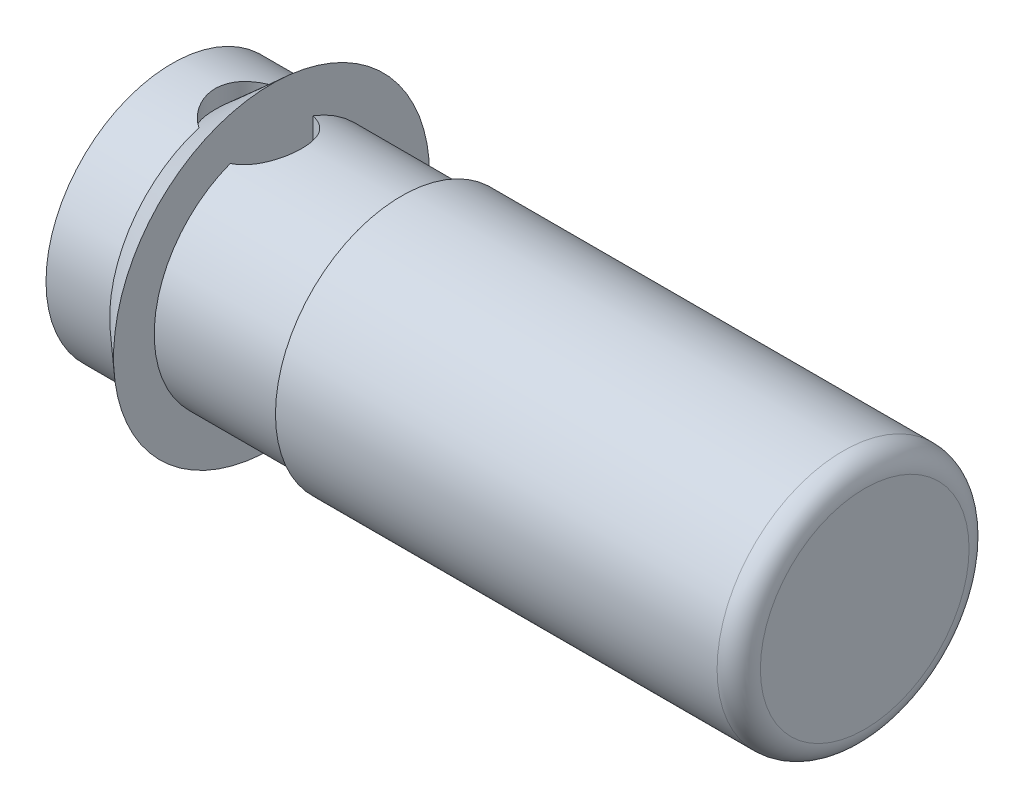
ISO-10303-21;
HEADER;
FILE_DESCRIPTION(('STEP AP214'),'2;1');
FILE_NAME('part.step','',(''),(''),'','','');
FILE_SCHEMA(('AUTOMOTIVE_DESIGN { 1 0 10303 214 1 1 1 1 }'));
ENDSEC;
DATA;
#1=APPLICATION_CONTEXT('core data for automotive mechanical design processes');
#2=APPLICATION_PROTOCOL_DEFINITION('international standard','automotive_design',2000,#1);
#3=PRODUCT_CONTEXT('',#1,'mechanical');
#4=PRODUCT('Part','Part','',(#3));
#5=PRODUCT_RELATED_PRODUCT_CATEGORY('part','',(#4));
#6=PRODUCT_DEFINITION_FORMATION('','',#4);
#7=PRODUCT_DEFINITION_CONTEXT('part definition',#1,'design');
#8=PRODUCT_DEFINITION('design','',#6,#7);
#9=PRODUCT_DEFINITION_SHAPE('','',#8);
#10=(LENGTH_UNIT() NAMED_UNIT(*) SI_UNIT(.MILLI.,.METRE.));
#11=(NAMED_UNIT(*) PLANE_ANGLE_UNIT() SI_UNIT($,.RADIAN.));
#12=(NAMED_UNIT(*) SI_UNIT($,.STERADIAN.) SOLID_ANGLE_UNIT());
#13=UNCERTAINTY_MEASURE_WITH_UNIT(LENGTH_MEASURE(1.E-05),#10,'distance_accuracy_value','');
#14=(GEOMETRIC_REPRESENTATION_CONTEXT(3) GLOBAL_UNCERTAINTY_ASSIGNED_CONTEXT((#13)) GLOBAL_UNIT_ASSIGNED_CONTEXT((#10,
#11,#12)) REPRESENTATION_CONTEXT('',''));
#15=CARTESIAN_POINT('',(0.,0.,0.));
#16=DIRECTION('',(0.,0.,1.));
#17=DIRECTION('',(1.,0.,0.));
#18=AXIS2_PLACEMENT_3D('',#15,#16,#17);
#19=CARTESIAN_POINT('',(1.,-2.5,0.));
#20=DIRECTION('',(0.,1.,0.));
#21=DIRECTION('',(0.,0.,1.));
#22=AXIS2_PLACEMENT_3D('',#19,#20,#21);
#23=CYLINDRICAL_SURFACE('',#22,0.500000000000001);
#24=DIRECTION('',(0.,1.,0.));
#25=VECTOR('',#24,1.);
#26=CARTESIAN_POINT('',(1.15,-2.5,-0.476969600708474));
#27=LINE('',#26,#25);
#28=CARTESIAN_POINT('',(1.15,1.26827638943568,-0.476969600708474));
#29=VERTEX_POINT('',#28);
#30=CARTESIAN_POINT('',(1.15,-1.26827638943568,-0.476969600708474));
#31=VERTEX_POINT('',#30);
#32=EDGE_CURVE('E109',#29,#31,#27,.F.);
#33=ORIENTED_EDGE('',*,*,#32,.T.);
#34=CARTESIAN_POINT('',(1.15,-1.26827638943568,-0.476969600708474));
#35=CARTESIAN_POINT('',(1.17707320786269,-1.27146217352284,-0.468471494215187));
#36=CARTESIAN_POINT('',(1.20329073628372,-1.27543470489075,-0.457680132332515));
#37=CARTESIAN_POINT('',(1.25337578262997,-1.28437862323989,-0.431957831491658));
#38=CARTESIAN_POINT('',(1.27724699269246,-1.2893484022229,-0.417033542077902));
#39=CARTESIAN_POINT('',(1.32207027598212,-1.29972115961105,-0.38347805003048));
#40=CARTESIAN_POINT('',(1.3430250507571,-1.3051237297039,-0.364850317343819));
#41=CARTESIAN_POINT('',(1.38156283330663,-1.3157783292706,-0.324332095393039));
#42=CARTESIAN_POINT('',(1.39914467710097,-1.3210303062457,-0.302440484397228));
#43=CARTESIAN_POINT('',(1.43080061311372,-1.33093293762257,-0.255404632348794));
#44=CARTESIAN_POINT('',(1.4447905460512,-1.3355681164359,-0.230200246198972));
#45=CARTESIAN_POINT('',(1.46828325346842,-1.34357423958663,-0.177594110362837));
#46=CARTESIAN_POINT('',(1.47778765886733,-1.34694564333552,-0.150193163582698));
#47=CARTESIAN_POINT('',(1.49163582105204,-1.35192112137594,-0.0952036968093729));
#48=CARTESIAN_POINT('',(1.49618106725334,-1.35359398936399,-0.0676722545700567));
#49=CARTESIAN_POINT('',(1.50062483097179,-1.35522900207713,-0.0121901372272815));
#50=CARTESIAN_POINT('',(1.50052483083461,-1.35519169253744,0.0157604012920708));
#51=CARTESIAN_POINT('',(1.4958025730897,-1.35345524542596,0.0698748884869474));
#52=CARTESIAN_POINT('',(1.49139560057745,-1.35183522156096,0.0960605883379962));
#53=CARTESIAN_POINT('',(1.47854269552372,-1.34721651902574,0.147290396409011));
#54=CARTESIAN_POINT('',(1.47009656906637,-1.34421777416473,0.172334449756397));
#55=CARTESIAN_POINT('',(1.44929414487845,-1.33708401285122,0.221011297041621));
#56=CARTESIAN_POINT('',(1.43688151655715,-1.33293274768171,0.244617536106446));
#57=CARTESIAN_POINT('',(1.40854366873735,-1.32391571325597,0.28947632883391));
#58=CARTESIAN_POINT('',(1.39261655408508,-1.31904955897749,0.310727603280625));
#59=CARTESIAN_POINT('',(1.35663778295056,-1.30877866046371,0.351556527651231));
#60=CARTESIAN_POINT('',(1.33640184255477,-1.30335903407353,0.370968073554817));
#61=CARTESIAN_POINT('',(1.29293739078891,-1.2928242936123,0.406162630831862));
#62=CARTESIAN_POINT('',(1.26971182943294,-1.28770888653161,0.421949176992239));
#63=CARTESIAN_POINT('',(1.23021517705009,-1.28015838579274,0.444184840885369));
#64=CARTESIAN_POINT('',(1.2146930912011,-1.27744775029141,0.451893046230115));
#65=CARTESIAN_POINT('',(1.18288582454099,-1.27248734724187,0.465674937975633));
#66=CARTESIAN_POINT('',(1.16660129239708,-1.27023719637683,0.47174998518289));
#67=CARTESIAN_POINT('',(1.15,-1.26827638943568,0.476969600708474));
#68=B_SPLINE_CURVE_WITH_KNOTS('',3,(#34,#35,#36,#37,#38,#39,#40,#41,#42,#43,#44,#45,#46,#47,#48,
#49,#50,#51,#52,#53,#54,#55,#56,#57,#58,#59,#60,#61,#62,#63,#64,#65,#66,#67),.UNSPECIFIED.,.F.,
.F.,(4,2,2,2,2,2,2,2,2,2,2,2,2,2,2,2,4),(0.,0.0854921715261541,0.170847584349931,
0.256123397013881,0.341428585169494,0.428580140143339,0.515699982714112,0.599130653744928,
0.682534701377104,0.76197241443351,0.841413941600532,0.922037935106363,1.0027055110529,
1.0880038005055,1.17321855783553,1.22575181590795,1.2782411647328),.UNSPECIFIED.);
#69=CARTESIAN_POINT('',(1.15,-1.26827638943568,0.476969600708474));
#70=VERTEX_POINT('',#69);
#71=EDGE_CURVE('E101',#31,#70,#68,.T.);
#72=ORIENTED_EDGE('',*,*,#71,.T.);
#73=DIRECTION('',(0.,1.,0.));
#74=VECTOR('',#73,1.);
#75=CARTESIAN_POINT('',(1.15,-2.5,0.476969600708474));
#76=LINE('',#75,#74);
#77=CARTESIAN_POINT('',(1.15,1.26827638943568,0.476969600708474));
#78=VERTEX_POINT('',#77);
#79=EDGE_CURVE('E111',#70,#78,#76,.T.);
#80=ORIENTED_EDGE('',*,*,#79,.T.);
#81=CARTESIAN_POINT('',(1.15,1.26827638943568,0.476969600708474));
#82=CARTESIAN_POINT('',(1.17707320786269,1.27146217352284,0.468471494215187));
#83=CARTESIAN_POINT('',(1.20329073628372,1.27543470489075,0.457680132332515));
#84=CARTESIAN_POINT('',(1.25337578262997,1.28437862323989,0.431957831491659));
#85=CARTESIAN_POINT('',(1.27724699269246,1.2893484022229,0.417033542077902));
#86=CARTESIAN_POINT('',(1.32207027598212,1.29972115961105,0.38347805003048));
#87=CARTESIAN_POINT('',(1.3430250507571,1.3051237297039,0.364850317343819));
#88=CARTESIAN_POINT('',(1.38156283330663,1.3157783292706,0.324332095393039));
#89=CARTESIAN_POINT('',(1.39914467710097,1.3210303062457,0.302440484397228));
#90=CARTESIAN_POINT('',(1.43080061311372,1.33093293762257,0.255404632348794));
#91=CARTESIAN_POINT('',(1.4447905460512,1.3355681164359,0.230200246198973));
#92=CARTESIAN_POINT('',(1.46828325346842,1.34357423958663,0.177594110362838));
#93=CARTESIAN_POINT('',(1.47778765886733,1.34694564333552,0.150193163582699));
#94=CARTESIAN_POINT('',(1.49163582105204,1.35192112137594,0.0952036968093734));
#95=CARTESIAN_POINT('',(1.49618106725334,1.35359398936399,0.0676722545700571));
#96=CARTESIAN_POINT('',(1.50062483097179,1.35522900207713,0.0121901372272819));
#97=CARTESIAN_POINT('',(1.50052483083461,1.35519169253744,-0.0157604012920704));
#98=CARTESIAN_POINT('',(1.4958025730897,1.35345524542596,-0.069874888486947));
#99=CARTESIAN_POINT('',(1.49139560057745,1.35183522156096,-0.0960605883379957));
#100=CARTESIAN_POINT('',(1.47854269552372,1.34721651902574,-0.14729039640901));
#101=CARTESIAN_POINT('',(1.47009656906637,1.34421777416473,-0.172334449756397));
#102=CARTESIAN_POINT('',(1.44929414487846,1.33708401285122,-0.221011297041621));
#103=CARTESIAN_POINT('',(1.43688151655715,1.33293274768171,-0.244617536106446));
#104=CARTESIAN_POINT('',(1.40854366873735,1.32391571325597,-0.28947632883391));
#105=CARTESIAN_POINT('',(1.39261655408508,1.31904955897749,-0.310727603280625));
#106=CARTESIAN_POINT('',(1.35663778295056,1.30877866046371,-0.35155652765123));
#107=CARTESIAN_POINT('',(1.33640184255477,1.30335903407353,-0.370968073554816));
#108=CARTESIAN_POINT('',(1.29293739078891,1.2928242936123,-0.406162630831862));
#109=CARTESIAN_POINT('',(1.26971182943294,1.28770888653161,-0.421949176992239));
#110=CARTESIAN_POINT('',(1.23021517705009,1.28015838579274,-0.444184840885369));
#111=CARTESIAN_POINT('',(1.2146930912011,1.27744775029141,-0.451893046230115));
#112=CARTESIAN_POINT('',(1.182885824541,1.27248734724187,-0.465674937975633));
#113=CARTESIAN_POINT('',(1.16660129239708,1.27023719637683,-0.47174998518289));
#114=CARTESIAN_POINT('',(1.15,1.26827638943568,-0.476969600708474));
#115=B_SPLINE_CURVE_WITH_KNOTS('',3,(#81,#82,#83,#84,#85,#86,#87,#88,#89,#90,#91,#92,#93,#94,
#95,#96,#97,#98,#99,#100,#101,#102,#103,#104,#105,#106,#107,#108,#109,#110,#111,#112,#113,#114),
.UNSPECIFIED.,.F.,.F.,(4,2,2,2,2,2,2,2,2,2,2,2,2,2,2,2,4),(0.,0.0854921715261543,
0.170847584349931,0.25612339701388,0.341428585169494,0.428580140143339,0.515699982714112,
0.599130653744928,0.682534701377104,0.76197241443351,0.841413941600532,0.922037935106362,
1.0027055110529,1.0880038005055,1.17321855783552,1.22575181590795,1.2782411647328),.UNSPECIFIED.);
#116=EDGE_CURVE('E98',#78,#29,#115,.T.);
#117=ORIENTED_EDGE('',*,*,#116,.T.);
#118=EDGE_LOOP('',(#33,#72,#80,#117));
#119=FACE_BOUND('',#118,.T.);
#120=ADVANCED_FACE('F42',(#119),#23,.F.);
#121=CARTESIAN_POINT('',(1.15,0.,0.));
#122=DIRECTION('',(1.,0.,0.));
#123=DIRECTION('',(0.,0.,-1.));
#124=AXIS2_PLACEMENT_3D('',#121,#122,#123);
#125=PLANE('',#124);
#126=ORIENTED_EDGE('',*,*,#32,.F.);
#127=CARTESIAN_POINT('',(1.15,0.,0.));
#128=DIRECTION('',(1.,0.,0.));
#129=DIRECTION('',(0.,0.,-1.));
#130=AXIS2_PLACEMENT_3D('',#127,#128,#129);
#131=CIRCLE('',#130,1.355);
#132=EDGE_CURVE('E95',#31,#29,#131,.T.);
#133=ORIENTED_EDGE('',*,*,#132,.F.);
#134=EDGE_LOOP('',(#126,#133));
#135=FACE_BOUND('',#134,.T.);
#136=ORIENTED_EDGE('',*,*,#79,.F.);
#137=EDGE_CURVE('E105',#78,#70,#131,.T.);
#138=ORIENTED_EDGE('',*,*,#137,.F.);
#139=EDGE_LOOP('',(#136,#138));
#140=FACE_BOUND('',#139,.T.);
#141=CARTESIAN_POINT('',(1.15,0.,0.));
#142=DIRECTION('',(1.,0.,0.));
#143=DIRECTION('',(0.,0.,-1.));
#144=AXIS2_PLACEMENT_3D('',#141,#142,#143);
#145=CIRCLE('',#144,1.825);
#146=CARTESIAN_POINT('',(1.15,0.,-1.825));
#147=VERTEX_POINT('',#146);
#148=EDGE_CURVE('E221',#147,#147,#145,.T.);
#149=ORIENTED_EDGE('',*,*,#148,.T.);
#150=EDGE_LOOP('',(#149));
#151=FACE_BOUND('',#150,.T.);
#152=ADVANCED_FACE('F114',(#135,#140,#151),#125,.T.);
#153=CARTESIAN_POINT('',(1.15,0.,0.));
#154=DIRECTION('',(1.,0.,0.));
#155=DIRECTION('',(0.,0.,-1.));
#156=AXIS2_PLACEMENT_3D('',#153,#154,#155);
#157=CONICAL_SURFACE('',#156,1.825,0.727990048760649);
#158=ORIENTED_EDGE('',*,*,#148,.F.);
#159=EDGE_LOOP('',(#158));
#160=FACE_BOUND('',#159,.T.);
#161=CARTESIAN_POINT('',(0.734878048780488,0.,0.));
#162=DIRECTION('',(1.,0.,0.));
#163=DIRECTION('',(0.,0.,-1.));
#164=AXIS2_PLACEMENT_3D('',#161,#162,#163);
#165=CIRCLE('',#164,1.455);
#166=CARTESIAN_POINT('',(0.734878048780488,-1.39187450907704,0.423922576635828));
#167=VERTEX_POINT('',#166);
#168=CARTESIAN_POINT('',(0.734878048780484,1.39187450907703,0.423922576635826));
#169=VERTEX_POINT('',#168);
#170=EDGE_CURVE('E119',#167,#169,#165,.F.);
#171=ORIENTED_EDGE('',*,*,#170,.F.);
#172=CARTESIAN_POINT('',(1.08402815427549,-1.69603056083662,-0.492888698682628));
#173=CARTESIAN_POINT('',(1.06912706986425,-1.68146215451666,-0.495425363460217));
#174=CARTESIAN_POINT('',(1.05409144566064,-1.66692555201327,-0.497297025572262));
#175=CARTESIAN_POINT('',(1.02376775711919,-1.63797991900439,-0.499667339972131));
#176=CARTESIAN_POINT('',(1.00847949419149,-1.62357100401303,-0.500164854864762));
#177=CARTESIAN_POINT('',(0.962035783845365,-1.5804243747266,-0.499523236731664));
#178=CARTESIAN_POINT('',(0.930556546092024,-1.55201789718606,-0.496204944834697));
#179=CARTESIAN_POINT('',(0.871562776100839,-1.50070098632695,-0.484030668670223));
#180=CARTESIAN_POINT('',(0.844081188211441,-1.47756366465976,-0.475974841156331));
#181=CARTESIAN_POINT('',(0.78957877667533,-1.43342933347381,-0.45450621835594));
#182=CARTESIAN_POINT('',(0.762556686793122,-1.41242518822005,-0.441112074425632));
#183=CARTESIAN_POINT('',(0.7151408425938,-1.37721862584324,-0.411670247708972));
#184=CARTESIAN_POINT('',(0.694491389198619,-1.36249192663769,-0.396667849743683));
#185=CARTESIAN_POINT('',(0.654903394365703,-1.33538401722898,-0.362748277716728));
#186=CARTESIAN_POINT('',(0.635964401429897,-1.32300218711527,-0.343832141100912));
#187=CARTESIAN_POINT('',(0.600658748367836,-1.30086329021434,-0.302121267724923));
#188=CARTESIAN_POINT('',(0.584310034932162,-1.29112422876772,-0.279301570750145));
#189=CARTESIAN_POINT('',(0.555367209079923,-1.27452600981576,-0.230448129938268));
#190=CARTESIAN_POINT('',(0.542771925333758,-1.2676659535883,-0.204415392385927));
#191=CARTESIAN_POINT('',(0.523344387720013,-1.25737485367337,-0.153176541623855));
#192=CARTESIAN_POINT('',(0.516017447939092,-1.2536411597553,-0.128216979873949));
#193=CARTESIAN_POINT('',(0.505318059995114,-1.24825703980475,-0.0772478886607582));
#194=CARTESIAN_POINT('',(0.501944853879415,-1.24660621447018,-0.0512385614326273));
#195=CARTESIAN_POINT('',(0.499361044429208,-1.24533843348936,0.000142046459201334));
#196=CARTESIAN_POINT('',(0.500012624439808,-1.24565414298062,0.0255048999415215));
#197=CARTESIAN_POINT('',(0.505126369259904,-1.24817607041727,0.0757451777246219));
#198=CARTESIAN_POINT('',(0.509587948095439,-1.25038199764927,0.100622676070755));
#199=CARTESIAN_POINT('',(0.522108615855352,-1.25676222024965,0.149154138271379));
#200=CARTESIAN_POINT('',(0.5301628169078,-1.26093384166457,0.172809715958147));
#201=CARTESIAN_POINT('',(0.549483612672926,-1.2713376616549,0.218277621393319));
#202=CARTESIAN_POINT('',(0.560749860955156,-1.27756963802545,0.240090147592511));
#203=CARTESIAN_POINT('',(0.586076409252665,-1.29219444341482,0.281536773743717));
#204=CARTESIAN_POINT('',(0.600162725044808,-1.3006076253612,0.301147717369096));
#205=CARTESIAN_POINT('',(0.630405986390042,-1.31947164627459,0.337581875634257));
#206=CARTESIAN_POINT('',(0.646563315234667,-1.32992286261676,0.354404572916077));
#207=CARTESIAN_POINT('',(0.681493607716794,-1.35345329167875,0.386200001666804));
#208=CARTESIAN_POINT('',(0.700370696473908,-1.36666593193989,0.400958335216493));
#209=CARTESIAN_POINT('',(0.7390869985445,-1.39483135734691,0.427167456010803));
#210=CARTESIAN_POINT('',(0.758926897805767,-1.40978539407791,0.438615843475009));
#211=CARTESIAN_POINT('',(0.809514872833869,-1.44921340976233,0.463544732738046));
#212=CARTESIAN_POINT('',(0.840566789077614,-1.47459189020377,0.474982532048995));
#213=CARTESIAN_POINT('',(0.902660150509213,-1.52741487361032,0.49148920227854));
#214=CARTESIAN_POINT('',(0.933701333304995,-1.55486485308673,0.496540515964789));
#215=CARTESIAN_POINT('',(0.984767633833629,-1.6014376892923,0.500184369281854));
#216=CARTESIAN_POINT('',(1.00498200648409,-1.62025153542169,0.500379177345684));
#217=CARTESIAN_POINT('',(1.04488484465355,-1.6580398320934,0.498376723935523));
#218=CARTESIAN_POINT('',(1.06457593556211,-1.67701234702015,0.496195567355824));
#219=CARTESIAN_POINT('',(1.08402815427549,-1.69603056083662,0.492888698682628));
#220=B_SPLINE_CURVE_WITH_KNOTS('',3,(#172,#173,#174,#175,#176,#177,#178,#179,#180,#181,#182,
#183,#184,#185,#186,#187,#188,#189,#190,#191,#192,#193,#194,#195,#196,#197,#198,#199,#200,#201,
#202,#203,#204,#205,#206,#207,#208,#209,#210,#211,#212,#213,#214,#215,#216,#217,#218,#219),
.UNSPECIFIED.,.F.,.F.,(4,2,2,2,2,2,2,2,2,2,2,2,2,2,2,2,2,2,2,2,2,2,2,4),(0.,0.0629531632558808,
0.125958417872378,0.25304272249733,0.363126944663535,0.472829872595913,0.560883661306851,
0.648914138735262,0.737530116953665,0.826118411829836,0.904564999012976,0.982996545089906,
1.05875767782518,1.13450716067307,1.21015389690693,1.28579247746203,1.36216397449434,
1.43854962640075,1.52032701974616,1.60216355558457,1.72658622205156,1.851350203169,
1.93409591003135,2.01628421573448),.UNSPECIFIED.);
#221=CARTESIAN_POINT('',(0.734878048780514,-1.39187450907704,-0.423922576635845));
#222=VERTEX_POINT('',#221);
#223=EDGE_CURVE('E211',#222,#167,#220,.T.);
#224=ORIENTED_EDGE('',*,*,#223,.F.);
#225=CARTESIAN_POINT('',(0.734878048780488,1.39187450907704,-0.423922576635828));
#226=VERTEX_POINT('',#225);
#227=EDGE_CURVE('E116',#226,#222,#165,.F.);
#228=ORIENTED_EDGE('',*,*,#227,.F.);
#229=CARTESIAN_POINT('',(1.08402815427549,1.69603056083662,0.492888698682628));
#230=CARTESIAN_POINT('',(1.06912706986425,1.68146215451666,0.495425363460217));
#231=CARTESIAN_POINT('',(1.05409144566064,1.66692555201327,0.497297025572262));
#232=CARTESIAN_POINT('',(1.02376775711919,1.63797991900439,0.499667339972131));
#233=CARTESIAN_POINT('',(1.00847949419149,1.62357100401303,0.500164854864762));
#234=CARTESIAN_POINT('',(0.962035783845365,1.5804243747266,0.499523236731664));
#235=CARTESIAN_POINT('',(0.930556546092024,1.55201789718606,0.496204944834697));
#236=CARTESIAN_POINT('',(0.871562776100839,1.50070098632695,0.484030668670223));
#237=CARTESIAN_POINT('',(0.844081188211441,1.47756366465976,0.475974841156331));
#238=CARTESIAN_POINT('',(0.78957877667533,1.43342933347381,0.45450621835594));
#239=CARTESIAN_POINT('',(0.762556686793122,1.41242518822005,0.441112074425632));
#240=CARTESIAN_POINT('',(0.7151408425938,1.37721862584324,0.411670247708972));
#241=CARTESIAN_POINT('',(0.694491389198619,1.36249192663769,0.396667849743683));
#242=CARTESIAN_POINT('',(0.654903394365703,1.33538401722898,0.362748277716728));
#243=CARTESIAN_POINT('',(0.635964401429897,1.32300218711527,0.343832141100912));
#244=CARTESIAN_POINT('',(0.600658748367836,1.30086329021434,0.302121267724923));
#245=CARTESIAN_POINT('',(0.584310034932162,1.29112422876772,0.279301570750145));
#246=CARTESIAN_POINT('',(0.555367209079923,1.27452600981576,0.230448129938268));
#247=CARTESIAN_POINT('',(0.542771925333758,1.2676659535883,0.204415392385927));
#248=CARTESIAN_POINT('',(0.523344387720013,1.25737485367337,0.153176541623855));
#249=CARTESIAN_POINT('',(0.516017447939092,1.2536411597553,0.128216979873949));
#250=CARTESIAN_POINT('',(0.505318059995114,1.24825703980475,0.0772478886607582));
#251=CARTESIAN_POINT('',(0.501944853879415,1.24660621447018,0.0512385614326273));
#252=CARTESIAN_POINT('',(0.499361044429208,1.24533843348936,-0.000142046459201334));
#253=CARTESIAN_POINT('',(0.500012624439808,1.24565414298062,-0.0255048999415215));
#254=CARTESIAN_POINT('',(0.505126369259904,1.24817607041727,-0.0757451777246219));
#255=CARTESIAN_POINT('',(0.509587948095439,1.25038199764927,-0.100622676070755));
#256=CARTESIAN_POINT('',(0.522108615855352,1.25676222024965,-0.149154138271379));
#257=CARTESIAN_POINT('',(0.5301628169078,1.26093384166457,-0.172809715958147));
#258=CARTESIAN_POINT('',(0.549483612672926,1.2713376616549,-0.218277621393319));
#259=CARTESIAN_POINT('',(0.560749860955156,1.27756963802545,-0.240090147592511));
#260=CARTESIAN_POINT('',(0.586076409252665,1.29219444341482,-0.281536773743717));
#261=CARTESIAN_POINT('',(0.600162725044808,1.3006076253612,-0.301147717369096));
#262=CARTESIAN_POINT('',(0.630405986390042,1.31947164627459,-0.337581875634257));
#263=CARTESIAN_POINT('',(0.646563315234667,1.32992286261676,-0.354404572916077));
#264=CARTESIAN_POINT('',(0.681493607716794,1.35345329167875,-0.386200001666804));
#265=CARTESIAN_POINT('',(0.700370696473908,1.36666593193989,-0.400958335216493));
#266=CARTESIAN_POINT('',(0.7390869985445,1.39483135734691,-0.427167456010803));
#267=CARTESIAN_POINT('',(0.758926897805767,1.40978539407791,-0.438615843475009));
#268=CARTESIAN_POINT('',(0.809514872833869,1.44921340976233,-0.463544732738046));
#269=CARTESIAN_POINT('',(0.840566789077614,1.47459189020377,-0.474982532048995));
#270=CARTESIAN_POINT('',(0.902660150509213,1.52741487361032,-0.49148920227854));
#271=CARTESIAN_POINT('',(0.933701333304995,1.55486485308673,-0.496540515964789));
#272=CARTESIAN_POINT('',(0.984767633833629,1.6014376892923,-0.500184369281854));
#273=CARTESIAN_POINT('',(1.00498200648409,1.62025153542169,-0.500379177345684));
#274=CARTESIAN_POINT('',(1.04488484465355,1.6580398320934,-0.498376723935523));
#275=CARTESIAN_POINT('',(1.06457593556211,1.67701234702015,-0.496195567355824));
#276=CARTESIAN_POINT('',(1.08402815427549,1.69603056083662,-0.492888698682628));
#277=B_SPLINE_CURVE_WITH_KNOTS('',3,(#229,#230,#231,#232,#233,#234,#235,#236,#237,#238,#239,
#240,#241,#242,#243,#244,#245,#246,#247,#248,#249,#250,#251,#252,#253,#254,#255,#256,#257,#258,
#259,#260,#261,#262,#263,#264,#265,#266,#267,#268,#269,#270,#271,#272,#273,#274,#275,#276),
.UNSPECIFIED.,.F.,.F.,(4,2,2,2,2,2,2,2,2,2,2,2,2,2,2,2,2,2,2,2,2,2,2,4),(0.,0.0629531632558808,
0.125958417872378,0.25304272249733,0.363126944663535,0.472829872595913,0.560883661306851,
0.648914138735262,0.737530116953665,0.826118411829836,0.904564999012976,0.982996545089906,
1.05875767782518,1.13450716067307,1.21015389690693,1.28579247746203,1.36216397449434,
1.43854962640075,1.52032701974616,1.60216355558457,1.72658622205156,1.851350203169,
1.93409591003135,2.01628421573448),.UNSPECIFIED.);
#278=EDGE_CURVE('E218',#169,#226,#277,.T.);
#279=ORIENTED_EDGE('',*,*,#278,.F.);
#280=EDGE_LOOP('',(#171,#224,#228,#279));
#281=FACE_BOUND('',#280,.T.);
#282=ADVANCED_FACE('F148',(#160,#281),#157,.T.);
#283=CARTESIAN_POINT('',(0.,0.,0.));
#284=DIRECTION('',(1.,0.,0.));
#285=DIRECTION('',(0.,0.,-1.));
#286=AXIS2_PLACEMENT_3D('',#283,#284,#285);
#287=PLANE('',#286);
#288=CARTESIAN_POINT('',(0.,0.,0.));
#289=DIRECTION('',(1.,0.,0.));
#290=DIRECTION('',(0.,0.,-1.));
#291=AXIS2_PLACEMENT_3D('',#288,#289,#290);
#292=CIRCLE('',#291,1.455);
#293=CARTESIAN_POINT('',(0.,0.,-1.455));
#294=VERTEX_POINT('',#293);
#295=EDGE_CURVE('E168',#294,#294,#292,.T.);
#296=ORIENTED_EDGE('',*,*,#295,.F.);
#297=EDGE_LOOP('',(#296));
#298=FACE_BOUND('',#297,.T.);
#299=ADVANCED_FACE('F187',(#298),#287,.F.);
#300=CARTESIAN_POINT('',(6.,0.,0.));
#301=DIRECTION('',(-1.,0.,0.));
#302=DIRECTION('',(0.,0.,1.));
#303=AXIS2_PLACEMENT_3D('',#300,#301,#302);
#304=CYLINDRICAL_SURFACE('',#303,1.455);
#305=ORIENTED_EDGE('',*,*,#295,.T.);
#306=EDGE_LOOP('',(#305));
#307=FACE_BOUND('',#306,.T.);
#308=CARTESIAN_POINT('',(1.,-1.36639123240747,0.500000000000001));
#309=CARTESIAN_POINT('',(1.02717955991746,-1.36639097811817,0.500000312731613));
#310=CARTESIAN_POINT('',(1.05435695805042,-1.3672110489003,0.497776345713997));
#311=CARTESIAN_POINT('',(1.10790316012987,-1.37038431023373,0.488971673841802));
#312=CARTESIAN_POINT('',(1.13427187170271,-1.37273767525038,0.482390473199555));
#313=CARTESIAN_POINT('',(1.18541562417104,-1.37868015875037,0.465132564264617));
#314=CARTESIAN_POINT('',(1.21019382677888,-1.38226672943625,0.454464294689386));
#315=CARTESIAN_POINT('',(1.25761726235279,-1.39026770944465,0.42936418702639));
#316=CARTESIAN_POINT('',(1.28026197809996,-1.39468231873585,0.414931439499747));
#317=CARTESIAN_POINT('',(1.32371799419318,-1.40404795409862,0.382068692414854));
#318=CARTESIAN_POINT('',(1.34442764982769,-1.40901294814996,0.363508230347457));
#319=CARTESIAN_POINT('',(1.38251026359022,-1.41880223847988,0.323194958876108));
#320=CARTESIAN_POINT('',(1.39988264712127,-1.42362651040849,0.301441600868594));
#321=CARTESIAN_POINT('',(1.43126543844549,-1.43275353066899,0.25461005240966));
#322=CARTESIAN_POINT('',(1.44516840090946,-1.43703795070782,0.229455972061946));
#323=CARTESIAN_POINT('',(1.46850489200208,-1.44443717268994,0.176993427231699));
#324=CARTESIAN_POINT('',(1.47793970594978,-1.44755231093828,0.149685584945859));
#325=CARTESIAN_POINT('',(1.49172461408698,-1.45216299283854,0.0947571154949558));
#326=CARTESIAN_POINT('',(1.49624903833515,-1.45371391556177,0.0671849745644271));
#327=CARTESIAN_POINT('',(1.5006400547362,-1.45521851130384,0.0116321325668069));
#328=CARTESIAN_POINT('',(1.50050792121369,-1.45517262131027,-0.0163484546287446));
#329=CARTESIAN_POINT('',(1.49569800888364,-1.45352574816606,-0.0706863211139648));
#330=CARTESIAN_POINT('',(1.49120979033516,-1.45198961593433,-0.0970626718601396));
#331=CARTESIAN_POINT('',(1.47812986112621,-1.44761714360993,-0.148662052440881));
#332=CARTESIAN_POINT('',(1.46953786826021,-1.44478071409985,-0.173885002828481));
#333=CARTESIAN_POINT('',(1.44838916471048,-1.43804602880742,-0.222864410317829));
#334=CARTESIAN_POINT('',(1.43578032109064,-1.43413390908427,-0.246596372051854));
#335=CARTESIAN_POINT('',(1.40699947712573,-1.42565240959854,-0.291662127171062));
#336=CARTESIAN_POINT('',(1.39082644364859,-1.42108283939799,-0.312995222496681));
#337=CARTESIAN_POINT('',(1.35443075951494,-1.41149683623095,-0.353783192591456));
#338=CARTESIAN_POINT('',(1.3340464503007,-1.40646948255308,-0.373091465112166));
#339=CARTESIAN_POINT('',(1.29028903101524,-1.39672419493074,-0.408064861632907));
#340=CARTESIAN_POINT('',(1.26691539920394,-1.39200631521816,-0.423729348317868));
#341=CARTESIAN_POINT('',(1.21735167832106,-1.38335212869181,-0.451190983426911));
#342=CARTESIAN_POINT('',(1.19112253336528,-1.37942952410187,-0.462922294548846));
#343=CARTESIAN_POINT('',(1.13689188192548,-1.37296824111035,-0.481750423449409));
#344=CARTESIAN_POINT('',(1.10889118086031,-1.37042893878043,-0.488849330926126));
#345=CARTESIAN_POINT('',(1.05333974727151,-1.36716435499601,-0.497904436508698));
#346=CARTESIAN_POINT('',(1.02583103246436,-1.36635848431615,-0.500089329754137));
#347=CARTESIAN_POINT('',(0.970834076817818,-1.36642601678656,-0.499905109547407));
#348=CARTESIAN_POINT('',(0.943345833016482,-1.3672990898199,-0.497536891336228));
#349=CARTESIAN_POINT('',(0.89024061650609,-1.37054542078883,-0.488519667509383));
#350=CARTESIAN_POINT('',(0.864592090455212,-1.37286149883476,-0.48203365376347));
#351=CARTESIAN_POINT('',(0.814753967294109,-1.37866879378836,-0.465162761685819));
#352=CARTESIAN_POINT('',(0.790564639823579,-1.38216022710582,-0.454777165311102));
#353=CARTESIAN_POINT('',(0.743440980954926,-1.39006814276105,-0.43001094582003));
#354=CARTESIAN_POINT('',(0.720574964437897,-1.39451148507407,-0.415509150754988));
#355=CARTESIAN_POINT('',(0.677518570222495,-1.40377216610918,-0.383057444619012));
#356=CARTESIAN_POINT('',(0.657329031733987,-1.40858962138712,-0.36510645635444));
#357=CARTESIAN_POINT('',(0.619120005822596,-1.4183566247392,-0.325165888852871));
#358=CARTESIAN_POINT('',(0.601266446572596,-1.42330014506522,-0.303015612372772));
#359=CARTESIAN_POINT('',(0.569516796073355,-1.43251855204168,-0.255911546870539));
#360=CARTESIAN_POINT('',(0.55562059249408,-1.43679345766928,-0.230957837452242));
#361=CARTESIAN_POINT('',(0.532301461911461,-1.44417620196691,-0.179059058741343));
#362=CARTESIAN_POINT('',(0.522851852534222,-1.44729097799921,-0.152127018589828));
#363=CARTESIAN_POINT('',(0.508658546537783,-1.45203172010686,-0.0969269784819331));
#364=CARTESIAN_POINT('',(0.503913031961385,-1.45365826131074,-0.0686594990512476));
#365=CARTESIAN_POINT('',(0.499434219526714,-1.45519317203768,-0.0131041048340681));
#366=CARTESIAN_POINT('',(0.499463382106119,-1.45518296986363,0.0141626088901554));
#367=CARTESIAN_POINT('',(0.503941183256072,-1.45364883351676,0.0682845844306882));
#368=CARTESIAN_POINT('',(0.508389424589131,-1.4521250354033,0.09513988300938));
#369=CARTESIAN_POINT('',(0.521418828841597,-1.44776668608656,0.147199119922216));
#370=CARTESIAN_POINT('',(0.529925168351417,-1.44495590074719,0.172423918976896));
#371=CARTESIAN_POINT('',(0.550758934886137,-1.43831337530625,0.221096451645461));
#372=CARTESIAN_POINT('',(0.563087065989574,-1.43448144710052,0.244543856823398));
#373=CARTESIAN_POINT('',(0.591757260255257,-1.42600590188723,0.289977341868479));
#374=CARTESIAN_POINT('',(0.608235115472222,-1.42133679417001,0.311872906947894));
#375=CARTESIAN_POINT('',(0.644510225345273,-1.41176919148188,0.352664883251738));
#376=CARTESIAN_POINT('',(0.664308572210529,-1.40687062141728,0.371560303644531));
#377=CARTESIAN_POINT('',(0.707663432276372,-1.39714764987157,0.40663128516264));
#378=CARTESIAN_POINT('',(0.731343552744042,-1.39233516519014,0.422657858662001));
#379=CARTESIAN_POINT('',(0.781212357138779,-1.38357941215645,0.450496342588288));
#380=CARTESIAN_POINT('',(0.807400584089769,-1.37963598589265,0.462309018939636));
#381=CARTESIAN_POINT('',(0.860912354434712,-1.37320179115005,0.48108071708729));
#382=CARTESIAN_POINT('',(0.888192784479065,-1.37067801956557,0.488150816278888));
#383=CARTESIAN_POINT('',(0.943649829932064,-1.36727320579147,0.497609344327993));
#384=CARTESIAN_POINT('',(0.971826076393858,-1.36639149599994,0.499999675827108));
#385=CARTESIAN_POINT('',(1.,-1.36639123240747,0.500000000000001));
#386=B_SPLINE_CURVE_WITH_KNOTS('',3,(#308,#309,#310,#311,#312,#313,#314,#315,#316,#317,#318,
#319,#320,#321,#322,#323,#324,#325,#326,#327,#328,#329,#330,#331,#332,#333,#334,#335,#336,#337,
#338,#339,#340,#341,#342,#343,#344,#345,#346,#347,#348,#349,#350,#351,#352,#353,#354,#355,#356,
#357,#358,#359,#360,#361,#362,#363,#364,#365,#366,#367,#368,#369,#370,#371,#372,#373,#374,#375,
#376,#377,#378,#379,#380,#381,#382,#383,#384,#385),.UNSPECIFIED.,.T.,.F.,(4,2,2,2,2,2,2,2,2,2,2,
2,2,2,2,2,2,2,2,2,2,2,2,2,2,2,2,2,2,2,2,2,2,2,2,2,2,2,4),(0.,0.0814342083502876,
0.162877684281833,0.244153899431235,0.325449767856163,0.409818297556402,0.494201340468621,
0.580941073467996,0.667655839514619,0.751179712047528,0.834680727417569,0.914703835375721,
0.994732447100177,1.07584520035367,1.1569814963114,1.24216162082256,1.32735663254974,
1.41391378507749,1.50043186424294,1.58283194249355,1.66521582074902,1.74452634377262,
1.82385147767105,1.90580983357864,1.98779382705759,2.07401200384483,2.16022773307441,
2.24591929981545,2.33157773703578,2.41297604003756,2.49436702668819,2.57431213634006,
2.65427198282888,2.73729800330363,2.82035138727782,2.90692039451618,2.99347365881173,
3.07792147702076,3.16233495435282),.UNSPECIFIED.);
#387=EDGE_CURVE('E171',#222,#167,#386,.T.);
#388=ORIENTED_EDGE('',*,*,#387,.T.);
#389=ORIENTED_EDGE('',*,*,#170,.T.);
#390=CARTESIAN_POINT('',(1.,1.36639123240747,0.500000000000001));
#391=CARTESIAN_POINT('',(0.972820440082541,1.36639097811817,0.500000312731613));
#392=CARTESIAN_POINT('',(0.94564304194958,1.3672110489003,0.497776345713997));
#393=CARTESIAN_POINT('',(0.892096839870125,1.37038431023373,0.488971673841802));
#394=CARTESIAN_POINT('',(0.865728128297294,1.37273767525038,0.482390473199555));
#395=CARTESIAN_POINT('',(0.814584375828964,1.37868015875037,0.465132564264617));
#396=CARTESIAN_POINT('',(0.789806173221123,1.38226672943625,0.454464294689386));
#397=CARTESIAN_POINT('',(0.742382737647213,1.39026770944465,0.42936418702639));
#398=CARTESIAN_POINT('',(0.719738021900039,1.39468231873585,0.414931439499747));
#399=CARTESIAN_POINT('',(0.676282005806817,1.40404795409862,0.382068692414854));
#400=CARTESIAN_POINT('',(0.65557235017231,1.40901294814996,0.363508230347457));
#401=CARTESIAN_POINT('',(0.617489736409782,1.41880223847988,0.323194958876108));
#402=CARTESIAN_POINT('',(0.600117352878733,1.42362651040849,0.301441600868594));
#403=CARTESIAN_POINT('',(0.568734561554506,1.43275353066899,0.25461005240966));
#404=CARTESIAN_POINT('',(0.554831599090541,1.43703795070782,0.229455972061945));
#405=CARTESIAN_POINT('',(0.531495107997923,1.44443717268994,0.176993427231699));
#406=CARTESIAN_POINT('',(0.522060294050224,1.44755231093828,0.149685584945859));
#407=CARTESIAN_POINT('',(0.508275385913023,1.45216299283854,0.0947571154949556));
#408=CARTESIAN_POINT('',(0.503750961664854,1.45371391556177,0.067184974564427));
#409=CARTESIAN_POINT('',(0.499359945263802,1.45521851130384,0.0116321325668068));
#410=CARTESIAN_POINT('',(0.499492078786311,1.45517262131027,-0.0163484546287447));
#411=CARTESIAN_POINT('',(0.504301991116359,1.45352574816606,-0.0706863211139648));
#412=CARTESIAN_POINT('',(0.508790209664839,1.45198961593433,-0.0970626718601396));
#413=CARTESIAN_POINT('',(0.521870138873795,1.44761714360993,-0.148662052440881));
#414=CARTESIAN_POINT('',(0.53046213173979,1.44478071409985,-0.173885002828482));
#415=CARTESIAN_POINT('',(0.551610835289516,1.43804602880742,-0.222864410317829));
#416=CARTESIAN_POINT('',(0.56421967890936,1.43413390908427,-0.246596372051854));
#417=CARTESIAN_POINT('',(0.593000522874273,1.42565240959854,-0.291662127171063));
#418=CARTESIAN_POINT('',(0.609173556351408,1.42108283939799,-0.312995222496682));
#419=CARTESIAN_POINT('',(0.645569240485055,1.41149683623094,-0.353783192591456));
#420=CARTESIAN_POINT('',(0.665953549699301,1.40646948255308,-0.373091465112166));
#421=CARTESIAN_POINT('',(0.709710968984758,1.39672419493074,-0.408064861632907));
#422=CARTESIAN_POINT('',(0.733084600796064,1.39200631521816,-0.423729348317868));
#423=CARTESIAN_POINT('',(0.782648321678941,1.38335212869181,-0.451190983426911));
#424=CARTESIAN_POINT('',(0.808877466634715,1.37942952410187,-0.462922294548846));
#425=CARTESIAN_POINT('',(0.863108118074524,1.37296824111035,-0.481750423449409));
#426=CARTESIAN_POINT('',(0.891108819139693,1.37042893878043,-0.488849330926126));
#427=CARTESIAN_POINT('',(0.946660252728495,1.36716435499601,-0.497904436508698));
#428=CARTESIAN_POINT('',(0.974168967535642,1.36635848431615,-0.500089329754137));
#429=CARTESIAN_POINT('',(1.02916592318218,1.36642601678656,-0.499905109547407));
#430=CARTESIAN_POINT('',(1.05665416698352,1.3672990898199,-0.497536891336228));
#431=CARTESIAN_POINT('',(1.10975938349391,1.37054542078883,-0.488519667509383));
#432=CARTESIAN_POINT('',(1.13540790954479,1.37286149883476,-0.48203365376347));
#433=CARTESIAN_POINT('',(1.18524603270589,1.37866879378836,-0.465162761685819));
#434=CARTESIAN_POINT('',(1.20943536017642,1.38216022710582,-0.454777165311102));
#435=CARTESIAN_POINT('',(1.25655901904507,1.39006814276105,-0.43001094582003));
#436=CARTESIAN_POINT('',(1.2794250355621,1.39451148507407,-0.415509150754988));
#437=CARTESIAN_POINT('',(1.3224814297775,1.40377216610918,-0.383057444619012));
#438=CARTESIAN_POINT('',(1.34267096826601,1.40858962138712,-0.36510645635444));
#439=CARTESIAN_POINT('',(1.3808799941774,1.4183566247392,-0.325165888852871));
#440=CARTESIAN_POINT('',(1.3987335534274,1.42330014506522,-0.303015612372771));
#441=CARTESIAN_POINT('',(1.43048320392665,1.43251855204168,-0.255911546870539));
#442=CARTESIAN_POINT('',(1.44437940750592,1.43679345766928,-0.230957837452242));
#443=CARTESIAN_POINT('',(1.46769853808854,1.44417620196691,-0.179059058741343));
#444=CARTESIAN_POINT('',(1.47714814746578,1.44729097799921,-0.152127018589828));
#445=CARTESIAN_POINT('',(1.49134145346222,1.45203172010686,-0.0969269784819331));
#446=CARTESIAN_POINT('',(1.49608696803861,1.45365826131074,-0.0686594990512475));
#447=CARTESIAN_POINT('',(1.50056578047329,1.45519317203768,-0.0131041048340679));
#448=CARTESIAN_POINT('',(1.50053661789388,1.45518296986363,0.0141626088901558));
#449=CARTESIAN_POINT('',(1.49605881674393,1.45364883351676,0.0682845844306886));
#450=CARTESIAN_POINT('',(1.49161057541087,1.4521250354033,0.0951398830093801));
#451=CARTESIAN_POINT('',(1.4785811711584,1.44776668608656,0.147199119922216));
#452=CARTESIAN_POINT('',(1.47007483164858,1.44495590074719,0.172423918976896));
#453=CARTESIAN_POINT('',(1.44924106511386,1.43831337530625,0.221096451645461));
#454=CARTESIAN_POINT('',(1.43691293401043,1.43448144710052,0.244543856823398));
#455=CARTESIAN_POINT('',(1.40824273974474,1.42600590188723,0.289977341868479));
#456=CARTESIAN_POINT('',(1.39176488452778,1.42133679417001,0.311872906947894));
#457=CARTESIAN_POINT('',(1.35548977465473,1.41176919148188,0.352664883251737));
#458=CARTESIAN_POINT('',(1.33569142778947,1.40687062141728,0.371560303644531));
#459=CARTESIAN_POINT('',(1.29233656772363,1.39714764987157,0.40663128516264));
#460=CARTESIAN_POINT('',(1.26865644725596,1.39233516519014,0.422657858662001));
#461=CARTESIAN_POINT('',(1.21878764286122,1.38357941215645,0.450496342588288));
#462=CARTESIAN_POINT('',(1.19259941591023,1.37963598589265,0.462309018939636));
#463=CARTESIAN_POINT('',(1.13908764556529,1.37320179115005,0.48108071708729));
#464=CARTESIAN_POINT('',(1.11180721552094,1.37067801956557,0.488150816278888));
#465=CARTESIAN_POINT('',(1.05635017006794,1.36727320579147,0.497609344327993));
#466=CARTESIAN_POINT('',(1.02817392360614,1.36639149599994,0.499999675827108));
#467=CARTESIAN_POINT('',(1.,1.36639123240747,0.500000000000001));
#468=B_SPLINE_CURVE_WITH_KNOTS('',3,(#390,#391,#392,#393,#394,#395,#396,#397,#398,#399,#400,
#401,#402,#403,#404,#405,#406,#407,#408,#409,#410,#411,#412,#413,#414,#415,#416,#417,#418,#419,
#420,#421,#422,#423,#424,#425,#426,#427,#428,#429,#430,#431,#432,#433,#434,#435,#436,#437,#438,
#439,#440,#441,#442,#443,#444,#445,#446,#447,#448,#449,#450,#451,#452,#453,#454,#455,#456,#457,
#458,#459,#460,#461,#462,#463,#464,#465,#466,#467),.UNSPECIFIED.,.T.,.F.,(4,2,2,2,2,2,2,2,2,2,2,
2,2,2,2,2,2,2,2,2,2,2,2,2,2,2,2,2,2,2,2,2,2,2,2,2,2,2,4),(0.,0.0814342083502876,
0.162877684281833,0.244153899431235,0.325449767856164,0.409818297556402,0.494201340468621,
0.580941073467996,0.667655839514619,0.751179712047528,0.834680727417569,0.914703835375721,
0.994732447100177,1.07584520035367,1.1569814963114,1.24216162082256,1.32735663254974,
1.41391378507749,1.50043186424294,1.58283194249355,1.66521582074902,1.74452634377262,
1.82385147767105,1.90580983357864,1.98779382705759,2.07401200384483,2.16022773307441,
2.24591929981545,2.33157773703578,2.41297604003756,2.49436702668819,2.57431213634006,
2.65427198282888,2.73729800330363,2.82035138727782,2.90692039451618,2.99347365881173,
3.07792147702076,3.16233495435282),.UNSPECIFIED.);
#469=EDGE_CURVE('E177',#169,#226,#468,.T.);
#470=ORIENTED_EDGE('',*,*,#469,.T.);
#471=ORIENTED_EDGE('',*,*,#227,.T.);
#472=EDGE_LOOP('',(#388,#389,#470,#471));
#473=FACE_BOUND('',#472,.T.);
#474=ADVANCED_FACE('F186',(#307,#473),#304,.T.);
#475=ORIENTED_EDGE('',*,*,#387,.F.);
#476=ORIENTED_EDGE('',*,*,#223,.T.);
#477=EDGE_LOOP('',(#475,#476));
#478=FACE_BOUND('',#477,.T.);
#479=ADVANCED_FACE('F195',(#478),#23,.F.);
#480=ORIENTED_EDGE('',*,*,#469,.F.);
#481=ORIENTED_EDGE('',*,*,#278,.T.);
#482=EDGE_LOOP('',(#480,#481));
#483=FACE_BOUND('',#482,.T.);
#484=ADVANCED_FACE('F162',(#483),#23,.F.);
#485=CARTESIAN_POINT('',(2.65,0.,0.));
#486=DIRECTION('',(-1.,0.,0.));
#487=DIRECTION('',(0.,0.,1.));
#488=AXIS2_PLACEMENT_3D('',#485,#486,#487);
#489=CYLINDRICAL_SURFACE('',#488,1.355);
#490=CARTESIAN_POINT('',(2.65,0.,0.));
#491=DIRECTION('',(1.,0.,0.));
#492=DIRECTION('',(0.,0.,-1.));
#493=AXIS2_PLACEMENT_3D('',#490,#491,#492);
#494=CIRCLE('',#493,1.355);
#495=CARTESIAN_POINT('',(2.65,0.,-1.355));
#496=VERTEX_POINT('',#495);
#497=EDGE_CURVE('E364',#496,#496,#494,.T.);
#498=ORIENTED_EDGE('',*,*,#497,.F.);
#499=EDGE_LOOP('',(#498));
#500=FACE_BOUND('',#499,.T.);
#501=ORIENTED_EDGE('',*,*,#132,.T.);
#502=ORIENTED_EDGE('',*,*,#116,.F.);
#503=ORIENTED_EDGE('',*,*,#137,.T.);
#504=ORIENTED_EDGE('',*,*,#71,.F.);
#505=EDGE_LOOP('',(#501,#502,#503,#504));
#506=FACE_BOUND('',#505,.T.);
#507=ADVANCED_FACE('F97',(#500,#506),#489,.T.);
#508=CARTESIAN_POINT('',(2.65,0.,0.));
#509=DIRECTION('',(1.,0.,0.));
#510=DIRECTION('',(0.,0.,-1.));
#511=AXIS2_PLACEMENT_3D('',#508,#509,#510);
#512=PLANE('',#511);
#513=CARTESIAN_POINT('',(2.65,0.,0.));
#514=DIRECTION('',(1.,0.,0.));
#515=DIRECTION('',(0.,0.,-1.));
#516=AXIS2_PLACEMENT_3D('',#513,#514,#515);
#517=CIRCLE('',#516,1.455);
#518=CARTESIAN_POINT('',(2.65,0.,-1.455));
#519=VERTEX_POINT('',#518);
#520=EDGE_CURVE('E112',#519,#519,#517,.T.);
#521=ORIENTED_EDGE('',*,*,#520,.F.);
#522=EDGE_LOOP('',(#521));
#523=FACE_BOUND('',#522,.T.);
#524=ORIENTED_EDGE('',*,*,#497,.T.);
#525=EDGE_LOOP('',(#524));
#526=FACE_BOUND('',#525,.T.);
#527=ADVANCED_FACE('F248',(#523,#526),#512,.F.);
#528=CARTESIAN_POINT('',(8.,0.,0.));
#529=DIRECTION('',(1.,0.,0.));
#530=DIRECTION('',(0.,0.,-1.));
#531=AXIS2_PLACEMENT_3D('',#528,#529,#530);
#532=PLANE('',#531);
#533=CARTESIAN_POINT('',(8.,0.,0.));
#534=DIRECTION('',(1.,0.,0.));
#535=DIRECTION('',(0.,0.,-1.));
#536=AXIS2_PLACEMENT_3D('',#533,#534,#535);
#537=CIRCLE('',#536,1.205);
#538=CARTESIAN_POINT('',(8.,0.,-1.205));
#539=VERTEX_POINT('',#538);
#540=EDGE_CURVE('E51',#539,#539,#537,.T.);
#541=ORIENTED_EDGE('',*,*,#540,.T.);
#542=EDGE_LOOP('',(#541));
#543=FACE_BOUND('',#542,.T.);
#544=ADVANCED_FACE('F252',(#543),#532,.T.);
#545=CARTESIAN_POINT('',(7.75,0.,0.));
#546=DIRECTION('',(1.,0.,0.));
#547=DIRECTION('',(0.,0.,-1.));
#548=AXIS2_PLACEMENT_3D('',#545,#546,#547);
#549=TOROIDAL_SURFACE('',#548,1.205,0.25);
#550=CARTESIAN_POINT('',(7.75,0.,0.));
#551=DIRECTION('',(1.,0.,0.));
#552=DIRECTION('',(0.,0.,-1.));
#553=AXIS2_PLACEMENT_3D('',#550,#551,#552);
#554=CIRCLE('',#553,1.455);
#555=CARTESIAN_POINT('',(7.75,0.,-1.455));
#556=VERTEX_POINT('',#555);
#557=EDGE_CURVE('E11',#556,#556,#554,.F.);
#558=ORIENTED_EDGE('',*,*,#557,.F.);
#559=EDGE_LOOP('',(#558));
#560=FACE_BOUND('',#559,.T.);
#561=ORIENTED_EDGE('',*,*,#540,.F.);
#562=EDGE_LOOP('',(#561));
#563=FACE_BOUND('',#562,.T.);
#564=ADVANCED_FACE('F44',(#560,#563),#549,.T.);
#565=ORIENTED_EDGE('',*,*,#520,.T.);
#566=EDGE_LOOP('',(#565));
#567=FACE_BOUND('',#566,.T.);
#568=ORIENTED_EDGE('',*,*,#557,.T.);
#569=EDGE_LOOP('',(#568));
#570=FACE_BOUND('',#569,.T.);
#571=ADVANCED_FACE('F182',(#567,#570),#304,.T.);
#572=CLOSED_SHELL('',(#120,#152,#282,#299,#474,#479,#484,#507,#527,#544,#564,#571));
#573=DIRECTION('',(0.,1.,0.));
#574=VECTOR('',#573,1.);
#575=CARTESIAN_POINT('',(1.,-2.5,-0.500000000000001));
#576=LINE('',#575,#574);
#577=CARTESIAN_POINT('',(0.999999999999997,0.624499799839841,-0.500000000000001));
#578=VERTEX_POINT('',#577);
#579=CARTESIAN_POINT('',(1.,-0.624499799839839,-0.500000000000001));
#580=VERTEX_POINT('',#579);
#581=EDGE_CURVE('E121',#578,#580,#576,.F.);
#582=ORIENTED_EDGE('',*,*,#581,.F.);
#583=CARTESIAN_POINT('',(1.15,0.642261628933256,-0.476969600708474));
#584=CARTESIAN_POINT('',(1.12867885223205,0.637229430864218,-0.483706591157765));
#585=CARTESIAN_POINT('',(1.10664756050135,0.63313586254021,-0.489031688247521));
#586=CARTESIAN_POINT('',(1.06183528543802,0.627176155516816,-0.496672917239187));
#587=CARTESIAN_POINT('',(1.03905612693975,0.625304956933777,-0.498995885445688));
#588=CARTESIAN_POINT('',(0.993231628459322,0.624111893275571,-0.50048273746787));
#589=CARTESIAN_POINT('',(0.970185617403907,0.624799435344705,-0.499634964076611));
#590=CARTESIAN_POINT('',(0.924654319145724,0.628619345069042,-0.494820344569627));
#591=CARTESIAN_POINT('',(0.902168796125563,0.631750665990352,-0.490854833856308));
#592=CARTESIAN_POINT('',(0.858747664909579,0.639925718418871,-0.480144257078953));
#593=CARTESIAN_POINT('',(0.837789990676145,0.644929754455737,-0.47345664910934));
#594=CARTESIAN_POINT('',(0.79723922194991,0.656301844405192,-0.457562322678351));
#595=CARTESIAN_POINT('',(0.777647532061772,0.662671275682723,-0.448353057833004));
#596=CARTESIAN_POINT('',(0.736534442424297,0.677481084431319,-0.425716015802262));
#597=CARTESIAN_POINT('',(0.715328972940113,0.686086463103299,-0.411822637290452));
#598=CARTESIAN_POINT('',(0.675323582973083,0.703627287205069,-0.381080694397989));
#599=CARTESIAN_POINT('',(0.656525568042967,0.712562986970371,-0.364229813791231));
#600=CARTESIAN_POINT('',(0.618673610710064,0.731504130556303,-0.324741340453066));
#601=CARTESIAN_POINT('',(0.600096892125835,0.741440377633802,-0.301607442887226));
#602=CARTESIAN_POINT('',(0.567106684146417,0.759742450631138,-0.25197192586101));
#603=CARTESIAN_POINT('',(0.552691936458559,0.768108750926141,-0.225471327754901));
#604=CARTESIAN_POINT('',(0.529337849879685,0.781945777952563,-0.17118131670886));
#605=CARTESIAN_POINT('',(0.52015026695614,0.787545725232794,-0.143533139496922));
#606=CARTESIAN_POINT('',(0.506703421737197,0.795809492608613,-0.0866543178624981));
#607=CARTESIAN_POINT('',(0.502437065465536,0.798477538792866,-0.057426015032968));
#608=CARTESIAN_POINT('',(0.499378052735808,0.800388551621357,-0.00295262695991547));
#609=CARTESIAN_POINT('',(0.499866343270478,0.800081488489206,0.0222390907455354));
#610=CARTESIAN_POINT('',(0.504595986507573,0.797133353937414,0.0721258775873733));
#611=CARTESIAN_POINT('',(0.508837069159748,0.794492450460525,0.0968209823291694));
#612=CARTESIAN_POINT('',(0.52059958294205,0.787276543871584,0.144026920496831));
#613=CARTESIAN_POINT('',(0.527982085179714,0.782783680951872,0.166585664532407));
#614=CARTESIAN_POINT('',(0.545684940794699,0.772238112724984,0.210120084552336));
#615=CARTESIAN_POINT('',(0.556005796429593,0.76618514076257,0.231095489117731));
#616=CARTESIAN_POINT('',(0.580431060641032,0.75228130096149,0.273150614069028));
#617=CARTESIAN_POINT('',(0.594810967047843,0.744311053435326,0.2940301747666));
#618=CARTESIAN_POINT('',(0.626375113951236,0.727609841350347,0.333224862287558));
#619=CARTESIAN_POINT('',(0.643562387499731,0.718878058845316,0.351537175270993));
#620=CARTESIAN_POINT('',(0.683135398058585,0.700040546477616,0.387839243933122));
#621=CARTESIAN_POINT('',(0.705913620962986,0.689919576480586,0.405395286874191));
#622=CARTESIAN_POINT('',(0.754445276074374,0.670673133129706,0.436499885842443));
#623=CARTESIAN_POINT('',(0.78019692150781,0.661547068267387,0.450050831342152));
#624=CARTESIAN_POINT('',(0.828656007780286,0.647256448675392,0.470297593425534));
#625=CARTESIAN_POINT('',(0.850884348163835,0.641662769723138,0.477832717995457));
#626=CARTESIAN_POINT('',(0.896573000544036,0.632612625152165,0.489753048326422));
#627=CARTESIAN_POINT('',(0.92003112775793,0.629152500024247,0.494143649730543));
#628=CARTESIAN_POINT('',(0.967721560378111,0.624880775499411,0.499536658662068));
#629=CARTESIAN_POINT('',(0.991957565237097,0.624084645118742,0.500519278261841));
#630=CARTESIAN_POINT('',(1.04026063575288,0.625330423094072,0.498961580564828));
#631=CARTESIAN_POINT('',(1.06432762821947,0.627373492940199,0.496419821478791));
#632=CARTESIAN_POINT('',(1.09848615750468,0.632129477716754,0.490323683259107));
#633=CARTESIAN_POINT('',(1.10898173653832,0.63385543742298,0.488095795446778));
#634=CARTESIAN_POINT('',(1.12969704751335,0.637744954906771,0.483002779267777));
#635=CARTESIAN_POINT('',(1.13991757614192,0.639907048317994,0.480139780230321));
#636=CARTESIAN_POINT('',(1.15,0.642261628933256,0.476969600708474));
#637=B_SPLINE_CURVE_WITH_KNOTS('',3,(#583,#584,#585,#586,#587,#588,#589,#590,#591,#592,#593,
#594,#595,#596,#597,#598,#599,#600,#601,#602,#603,#604,#605,#606,#607,#608,#609,#610,#611,#612,
#613,#614,#615,#616,#617,#618,#619,#620,#621,#622,#623,#624,#625,#626,#627,#628,#629,#630,#631,
#632,#633,#634,#635,#636),.UNSPECIFIED.,.F.,.F.,(4,2,2,2,2,2,2,2,2,2,2,2,2,2,2,2,2,2,2,2,2,2,2,
2,2,2,4),(0.,0.0687501512276004,0.137343470431773,0.206189219914268,0.275005497149272,
0.342438873345401,0.409940596898373,0.489960557946583,0.570043470151259,0.663443001787012,
0.756814266213625,0.845271379272349,0.933600820918573,1.00880722253249,1.08400821274726,
1.15618186380003,1.22836785902804,1.30778721204773,1.38729294349676,1.47835415297572,
1.56936092444727,1.64145995345181,1.71343497040382,1.78582720603285,1.85824906536467,
1.89082619788483,1.92329571725149),.UNSPECIFIED.);
#638=CARTESIAN_POINT('',(1.,0.624499799839839,0.500000000000001));
#639=VERTEX_POINT('',#638);
#640=EDGE_CURVE('E133',#578,#639,#637,.T.);
#641=ORIENTED_EDGE('',*,*,#640,.T.);
#642=DIRECTION('',(0.,1.,0.));
#643=VECTOR('',#642,1.);
#644=CARTESIAN_POINT('',(1.,-2.5,0.500000000000001));
#645=LINE('',#644,#643);
#646=CARTESIAN_POINT('',(0.999999999999997,-0.624499799839841,0.500000000000001));
#647=VERTEX_POINT('',#646);
#648=EDGE_CURVE('E167',#647,#639,#645,.T.);
#649=ORIENTED_EDGE('',*,*,#648,.F.);
#650=CARTESIAN_POINT('',(1.15,-0.642261628933256,0.476969600708474));
#651=CARTESIAN_POINT('',(1.12867885223205,-0.637229430864218,0.483706591157765));
#652=CARTESIAN_POINT('',(1.10664756050135,-0.63313586254021,0.489031688247521));
#653=CARTESIAN_POINT('',(1.06183528543802,-0.627176155516816,0.496672917239187));
#654=CARTESIAN_POINT('',(1.03905612693975,-0.625304956933777,0.498995885445688));
#655=CARTESIAN_POINT('',(0.993231628459322,-0.624111893275571,0.50048273746787));
#656=CARTESIAN_POINT('',(0.970185617403907,-0.624799435344705,0.499634964076611));
#657=CARTESIAN_POINT('',(0.924654319145724,-0.628619345069042,0.494820344569627));
#658=CARTESIAN_POINT('',(0.902168796125563,-0.631750665990352,0.490854833856308));
#659=CARTESIAN_POINT('',(0.858747664909579,-0.639925718418871,0.480144257078953));
#660=CARTESIAN_POINT('',(0.837789990676145,-0.644929754455737,0.47345664910934));
#661=CARTESIAN_POINT('',(0.79723922194991,-0.656301844405192,0.457562322678351));
#662=CARTESIAN_POINT('',(0.777647532061772,-0.662671275682723,0.448353057833004));
#663=CARTESIAN_POINT('',(0.736534442424297,-0.677481084431319,0.425716015802262));
#664=CARTESIAN_POINT('',(0.715328972940113,-0.686086463103299,0.411822637290452));
#665=CARTESIAN_POINT('',(0.675323582973083,-0.703627287205069,0.381080694397989));
#666=CARTESIAN_POINT('',(0.656525568042967,-0.712562986970371,0.364229813791231));
#667=CARTESIAN_POINT('',(0.618673610710064,-0.731504130556303,0.324741340453066));
#668=CARTESIAN_POINT('',(0.600096892125835,-0.741440377633802,0.301607442887226));
#669=CARTESIAN_POINT('',(0.567106684146417,-0.759742450631138,0.25197192586101));
#670=CARTESIAN_POINT('',(0.552691936458559,-0.768108750926141,0.225471327754901));
#671=CARTESIAN_POINT('',(0.529337849879685,-0.781945777952563,0.17118131670886));
#672=CARTESIAN_POINT('',(0.52015026695614,-0.787545725232794,0.143533139496922));
#673=CARTESIAN_POINT('',(0.506703421737197,-0.795809492608613,0.0866543178624981));
#674=CARTESIAN_POINT('',(0.502437065465536,-0.798477538792866,0.057426015032968));
#675=CARTESIAN_POINT('',(0.499378052735808,-0.800388551621357,0.00295262695991547));
#676=CARTESIAN_POINT('',(0.499866343270478,-0.800081488489206,-0.0222390907455354));
#677=CARTESIAN_POINT('',(0.504595986507573,-0.797133353937414,-0.0721258775873733));
#678=CARTESIAN_POINT('',(0.508837069159748,-0.794492450460525,-0.0968209823291694));
#679=CARTESIAN_POINT('',(0.52059958294205,-0.787276543871584,-0.144026920496831));
#680=CARTESIAN_POINT('',(0.527982085179714,-0.782783680951872,-0.166585664532407));
#681=CARTESIAN_POINT('',(0.545684940794699,-0.772238112724984,-0.210120084552336));
#682=CARTESIAN_POINT('',(0.556005796429593,-0.76618514076257,-0.231095489117731));
#683=CARTESIAN_POINT('',(0.580431060641032,-0.75228130096149,-0.273150614069028));
#684=CARTESIAN_POINT('',(0.594810967047843,-0.744311053435326,-0.2940301747666));
#685=CARTESIAN_POINT('',(0.626375113951236,-0.727609841350347,-0.333224862287558));
#686=CARTESIAN_POINT('',(0.643562387499731,-0.718878058845316,-0.351537175270993));
#687=CARTESIAN_POINT('',(0.683135398058585,-0.700040546477616,-0.387839243933122));
#688=CARTESIAN_POINT('',(0.705913620962986,-0.689919576480586,-0.405395286874191));
#689=CARTESIAN_POINT('',(0.754445276074374,-0.670673133129706,-0.436499885842443));
#690=CARTESIAN_POINT('',(0.78019692150781,-0.661547068267387,-0.450050831342152));
#691=CARTESIAN_POINT('',(0.828656007780286,-0.647256448675392,-0.470297593425534));
#692=CARTESIAN_POINT('',(0.850884348163835,-0.641662769723138,-0.477832717995457));
#693=CARTESIAN_POINT('',(0.896573000544036,-0.632612625152165,-0.489753048326422));
#694=CARTESIAN_POINT('',(0.92003112775793,-0.629152500024247,-0.494143649730543));
#695=CARTESIAN_POINT('',(0.967721560378111,-0.624880775499411,-0.499536658662068));
#696=CARTESIAN_POINT('',(0.991957565237097,-0.624084645118742,-0.500519278261841));
#697=CARTESIAN_POINT('',(1.04026063575288,-0.625330423094072,-0.498961580564828));
#698=CARTESIAN_POINT('',(1.06432762821947,-0.627373492940199,-0.496419821478791));
#699=CARTESIAN_POINT('',(1.09848615750468,-0.632129477716754,-0.490323683259107));
#700=CARTESIAN_POINT('',(1.10898173653832,-0.63385543742298,-0.488095795446778));
#701=CARTESIAN_POINT('',(1.12969704751335,-0.637744954906771,-0.483002779267777));
#702=CARTESIAN_POINT('',(1.13991757614192,-0.639907048317994,-0.480139780230321));
#703=CARTESIAN_POINT('',(1.15,-0.642261628933256,-0.476969600708474));
#704=B_SPLINE_CURVE_WITH_KNOTS('',3,(#650,#651,#652,#653,#654,#655,#656,#657,#658,#659,#660,
#661,#662,#663,#664,#665,#666,#667,#668,#669,#670,#671,#672,#673,#674,#675,#676,#677,#678,#679,
#680,#681,#682,#683,#684,#685,#686,#687,#688,#689,#690,#691,#692,#693,#694,#695,#696,#697,#698,
#699,#700,#701,#702,#703),.UNSPECIFIED.,.F.,.F.,(4,2,2,2,2,2,2,2,2,2,2,2,2,2,2,2,2,2,2,2,2,2,2,
2,2,2,4),(0.,0.0687501512276004,0.137343470431773,0.206189219914268,0.275005497149272,
0.342438873345401,0.409940596898373,0.489960557946583,0.570043470151259,0.663443001787012,
0.756814266213625,0.845271379272349,0.933600820918573,1.00880722253249,1.08400821274726,
1.15618186380003,1.22836785902804,1.30778721204773,1.38729294349676,1.47835415297572,
1.56936092444727,1.64145995345181,1.71343497040382,1.78582720603285,1.85824906536467,
1.89082619788483,1.92329571725149),.UNSPECIFIED.);
#705=EDGE_CURVE('E125',#647,#580,#704,.T.);
#706=ORIENTED_EDGE('',*,*,#705,.T.);
#707=EDGE_LOOP('',(#582,#641,#649,#706));
#708=FACE_BOUND('',#707,.T.);
#709=ADVANCED_FACE('F155',(#708),#23,.F.);
#710=CARTESIAN_POINT('',(1.,0.,0.));
#711=DIRECTION('',(1.,0.,0.));
#712=DIRECTION('',(0.,0.,-1.));
#713=AXIS2_PLACEMENT_3D('',#710,#711,#712);
#714=PLANE('',#713);
#715=ORIENTED_EDGE('',*,*,#581,.T.);
#716=CARTESIAN_POINT('',(1.,0.,0.));
#717=DIRECTION('',(1.,0.,0.));
#718=DIRECTION('',(0.,0.,-1.));
#719=AXIS2_PLACEMENT_3D('',#716,#717,#718);
#720=CIRCLE('',#719,0.8);
#721=EDGE_CURVE('E64',#580,#647,#720,.F.);
#722=ORIENTED_EDGE('',*,*,#721,.T.);
#723=ORIENTED_EDGE('',*,*,#648,.T.);
#724=EDGE_CURVE('E57',#639,#578,#720,.F.);
#725=ORIENTED_EDGE('',*,*,#724,.T.);
#726=EDGE_LOOP('',(#715,#722,#723,#725));
#727=FACE_BOUND('',#726,.T.);
#728=ADVANCED_FACE('F153',(#727),#714,.F.);
#729=CARTESIAN_POINT('',(9.45,0.,0.));
#730=DIRECTION('',(1.,0.,0.));
#731=DIRECTION('',(0.,0.,-1.));
#732=AXIS2_PLACEMENT_3D('',#729,#730,#731);
#733=CYLINDRICAL_SURFACE('',#732,0.8);
#734=ORIENTED_EDGE('',*,*,#721,.F.);
#735=ORIENTED_EDGE('',*,*,#705,.F.);
#736=EDGE_LOOP('',(#734,#735));
#737=FACE_BOUND('',#736,.T.);
#738=ADVANCED_FACE('F146',(#737),#733,.F.);
#739=ORIENTED_EDGE('',*,*,#724,.F.);
#740=ORIENTED_EDGE('',*,*,#640,.F.);
#741=EDGE_LOOP('',(#739,#740));
#742=FACE_BOUND('',#741,.T.);
#743=ADVANCED_FACE('F141',(#742),#733,.F.);
#744=CLOSED_SHELL('',(#709,#728,#738,#743));
#745=ORIENTED_CLOSED_SHELL('',*,#744,.T.);
#746=BREP_WITH_VOIDS('B2',#572,(#745));
#747=ADVANCED_BREP_SHAPE_REPRESENTATION('',(#18,#746),#14);
#748=SHAPE_DEFINITION_REPRESENTATION(#9,#747);
ENDSEC;
END-ISO-10303-21;
